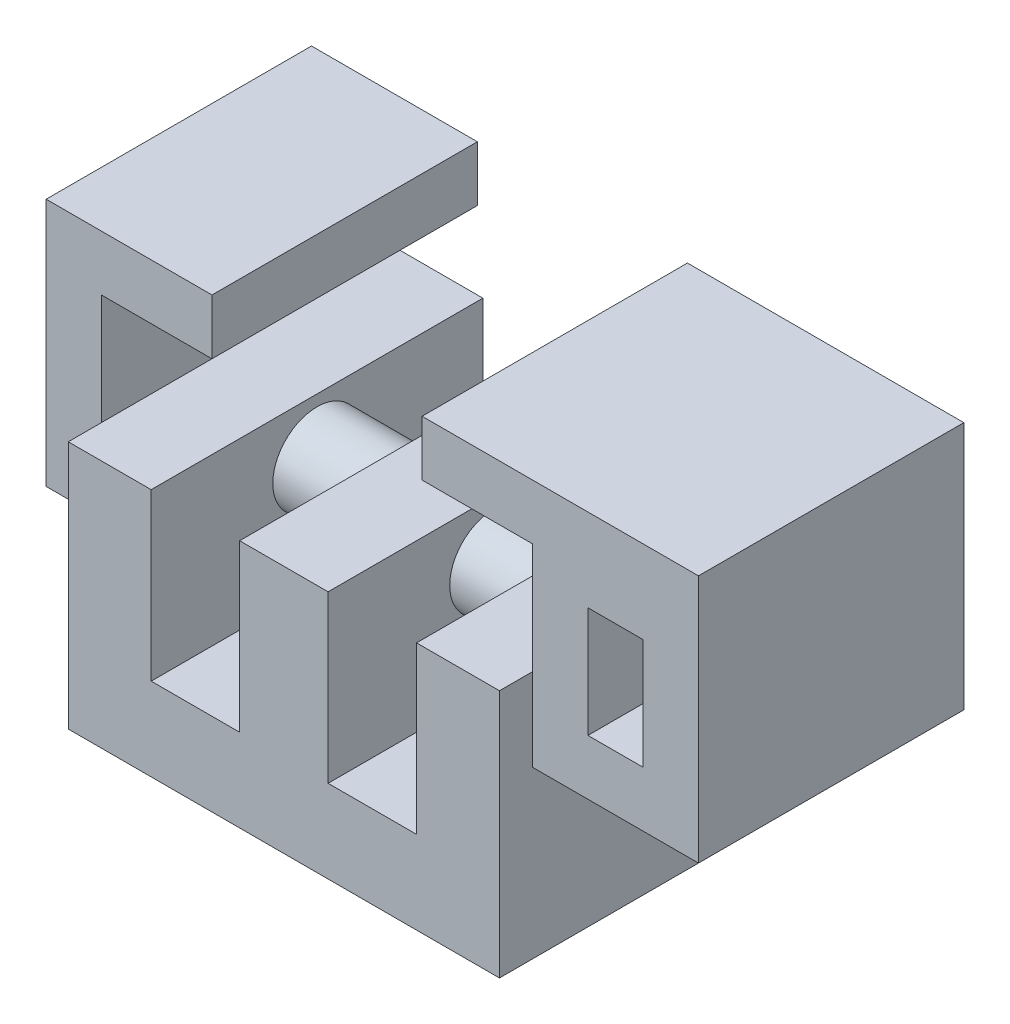
ISO-10303-21;
HEADER;
FILE_DESCRIPTION(('STEP AP214'),'2;1');
FILE_NAME('part.step','',(''),(''),'','','');
FILE_SCHEMA(('AUTOMOTIVE_DESIGN { 1 0 10303 214 1 1 1 1 }'));
ENDSEC;
DATA;
#1=APPLICATION_CONTEXT('core data for automotive mechanical design processes');
#2=APPLICATION_PROTOCOL_DEFINITION('international standard','automotive_design',2000,#1);
#3=PRODUCT_CONTEXT('',#1,'mechanical');
#4=PRODUCT('Part','Part','',(#3));
#5=PRODUCT_RELATED_PRODUCT_CATEGORY('part','',(#4));
#6=PRODUCT_DEFINITION_FORMATION('','',#4);
#7=PRODUCT_DEFINITION_CONTEXT('part definition',#1,'design');
#8=PRODUCT_DEFINITION('design','',#6,#7);
#9=PRODUCT_DEFINITION_SHAPE('','',#8);
#10=(LENGTH_UNIT() NAMED_UNIT(*) SI_UNIT(.MILLI.,.METRE.));
#11=(NAMED_UNIT(*) PLANE_ANGLE_UNIT() SI_UNIT($,.RADIAN.));
#12=(NAMED_UNIT(*) SI_UNIT($,.STERADIAN.) SOLID_ANGLE_UNIT());
#13=UNCERTAINTY_MEASURE_WITH_UNIT(LENGTH_MEASURE(1.E-05),#10,'distance_accuracy_value','');
#14=(GEOMETRIC_REPRESENTATION_CONTEXT(3) GLOBAL_UNCERTAINTY_ASSIGNED_CONTEXT((#13)) GLOBAL_UNIT_ASSIGNED_CONTEXT((#10,
#11,#12)) REPRESENTATION_CONTEXT('',''));
#15=CARTESIAN_POINT('',(0.,0.,0.));
#16=DIRECTION('',(0.,0.,1.));
#17=DIRECTION('',(1.,0.,0.));
#18=AXIS2_PLACEMENT_3D('',#15,#16,#17);
#19=CARTESIAN_POINT('',(0.,7.5,0.));
#20=DIRECTION('',(0.,-1.,0.));
#21=DIRECTION('',(0.,0.,-1.));
#22=AXIS2_PLACEMENT_3D('',#19,#20,#21);
#23=PLANE('',#22);
#24=DIRECTION('',(1.,0.,0.));
#25=VECTOR('',#24,1.);
#26=CARTESIAN_POINT('',(-19.5,7.5,15.));
#27=LINE('',#26,#25);
#28=CARTESIAN_POINT('',(-19.5,7.5,15.));
#29=VERTEX_POINT('',#28);
#30=CARTESIAN_POINT('',(-12.,7.5,15.));
#31=VERTEX_POINT('',#30);
#32=EDGE_CURVE('E490',#29,#31,#27,.T.);
#33=ORIENTED_EDGE('',*,*,#32,.T.);
#34=DIRECTION('',(0.,0.,1.));
#35=VECTOR('',#34,1.);
#36=CARTESIAN_POINT('',(-12.,7.5,-15.));
#37=LINE('',#36,#35);
#38=CARTESIAN_POINT('',(-12.,7.5,-15.));
#39=VERTEX_POINT('',#38);
#40=EDGE_CURVE('E314',#39,#31,#37,.T.);
#41=ORIENTED_EDGE('',*,*,#40,.F.);
#42=DIRECTION('',(-1.,0.,0.));
#43=VECTOR('',#42,1.);
#44=CARTESIAN_POINT('',(-19.5,7.5,-15.));
#45=LINE('',#44,#43);
#46=CARTESIAN_POINT('',(-19.5,7.5,-15.));
#47=VERTEX_POINT('',#46);
#48=EDGE_CURVE('E478',#39,#47,#45,.T.);
#49=ORIENTED_EDGE('',*,*,#48,.T.);
#50=DIRECTION('',(0.,0.,1.));
#51=VECTOR('',#50,1.);
#52=CARTESIAN_POINT('',(-19.5,7.5,15.));
#53=LINE('',#52,#51);
#54=CARTESIAN_POINT('',(-19.5,7.50000000000001,-12.));
#55=VERTEX_POINT('',#54);
#56=EDGE_CURVE('E485',#47,#55,#53,.T.);
#57=ORIENTED_EDGE('',*,*,#56,.T.);
#58=CARTESIAN_POINT('',(-19.5,7.50000000000001,12.));
#59=VERTEX_POINT('',#58);
#60=EDGE_CURVE('E489',#55,#59,#53,.T.);
#61=ORIENTED_EDGE('',*,*,#60,.T.);
#62=EDGE_CURVE('E483',#59,#29,#53,.T.);
#63=ORIENTED_EDGE('',*,*,#62,.T.);
#64=EDGE_LOOP('',(#33,#41,#49,#57,#61,#63));
#65=FACE_BOUND('',#64,.T.);
#66=ADVANCED_FACE('F36',(#65),#23,.F.);
#67=CARTESIAN_POINT('',(4.00000000000002,7.5,-15.));
#68=VERTEX_POINT('',#67);
#69=CARTESIAN_POINT('',(-3.99999999999998,7.5,-15.));
#70=VERTEX_POINT('',#69);
#71=EDGE_CURVE('E484',#68,#70,#45,.T.);
#72=ORIENTED_EDGE('',*,*,#71,.T.);
#73=DIRECTION('',(0.,0.,-1.));
#74=VECTOR('',#73,1.);
#75=CARTESIAN_POINT('',(-3.99999999999998,7.5,-15.));
#76=LINE('',#75,#74);
#77=CARTESIAN_POINT('',(-3.99999999999998,7.5,15.));
#78=VERTEX_POINT('',#77);
#79=EDGE_CURVE('E304',#78,#70,#76,.T.);
#80=ORIENTED_EDGE('',*,*,#79,.F.);
#81=CARTESIAN_POINT('',(4.00000000000002,7.5,15.));
#82=VERTEX_POINT('',#81);
#83=EDGE_CURVE('E494',#78,#82,#27,.T.);
#84=ORIENTED_EDGE('',*,*,#83,.T.);
#85=DIRECTION('',(0.,0.,1.));
#86=VECTOR('',#85,1.);
#87=CARTESIAN_POINT('',(4.00000000000002,7.5,-15.));
#88=LINE('',#87,#86);
#89=EDGE_CURVE('E316',#68,#82,#88,.T.);
#90=ORIENTED_EDGE('',*,*,#89,.F.);
#91=EDGE_LOOP('',(#72,#80,#84,#90));
#92=FACE_BOUND('',#91,.T.);
#93=ADVANCED_FACE('F602',(#92),#23,.F.);
#94=CARTESIAN_POINT('',(19.5,22.5,0.));
#95=DIRECTION('',(1.,0.,0.));
#96=DIRECTION('',(0.,0.,-1.));
#97=AXIS2_PLACEMENT_3D('',#94,#95,#96);
#98=PLANE('',#97);
#99=DIRECTION('',(0.,0.,1.));
#100=VECTOR('',#99,1.);
#101=CARTESIAN_POINT('',(19.5,17.5,-12.));
#102=LINE('',#101,#100);
#103=CARTESIAN_POINT('',(19.5,17.5,-12.));
#104=VERTEX_POINT('',#103);
#105=CARTESIAN_POINT('',(19.5,17.5,12.));
#106=VERTEX_POINT('',#105);
#107=EDGE_CURVE('E394',#104,#106,#102,.T.);
#108=ORIENTED_EDGE('',*,*,#107,.F.);
#109=DIRECTION('',(0.,-1.,0.));
#110=VECTOR('',#109,1.);
#111=CARTESIAN_POINT('',(19.5,22.5,-12.));
#112=LINE('',#111,#110);
#113=CARTESIAN_POINT('',(19.5,7.50000000000001,-12.));
#114=VERTEX_POINT('',#113);
#115=EDGE_CURVE('E431',#104,#114,#112,.T.);
#116=ORIENTED_EDGE('',*,*,#115,.T.);
#117=DIRECTION('',(0.,0.,-1.));
#118=VECTOR('',#117,1.);
#119=CARTESIAN_POINT('',(19.5,7.5,15.));
#120=LINE('',#119,#118);
#121=CARTESIAN_POINT('',(19.5,7.50000000000001,12.));
#122=VERTEX_POINT('',#121);
#123=EDGE_CURVE('E479',#122,#114,#120,.T.);
#124=ORIENTED_EDGE('',*,*,#123,.F.);
#125=DIRECTION('',(0.,-1.,0.));
#126=VECTOR('',#125,1.);
#127=CARTESIAN_POINT('',(19.5,22.5,12.));
#128=LINE('',#127,#126);
#129=EDGE_CURVE('E429',#106,#122,#128,.T.);
#130=ORIENTED_EDGE('',*,*,#129,.F.);
#131=EDGE_LOOP('',(#108,#116,#124,#130));
#132=FACE_BOUND('',#131,.T.);
#133=ADVANCED_FACE('F642',(#132),#98,.F.);
#134=CARTESIAN_POINT('',(-19.5,22.5,0.));
#135=DIRECTION('',(-1.,0.,0.));
#136=DIRECTION('',(0.,0.,1.));
#137=AXIS2_PLACEMENT_3D('',#134,#135,#136);
#138=PLANE('',#137);
#139=DIRECTION('',(0.,0.,-1.));
#140=VECTOR('',#139,1.);
#141=CARTESIAN_POINT('',(-19.5,17.5,-12.));
#142=LINE('',#141,#140);
#143=CARTESIAN_POINT('',(-19.5,17.5,12.));
#144=VERTEX_POINT('',#143);
#145=CARTESIAN_POINT('',(-19.5,17.5,-12.));
#146=VERTEX_POINT('',#145);
#147=EDGE_CURVE('E412',#144,#146,#142,.T.);
#148=ORIENTED_EDGE('',*,*,#147,.F.);
#149=DIRECTION('',(0.,-1.,0.));
#150=VECTOR('',#149,1.);
#151=CARTESIAN_POINT('',(-19.5,22.5,12.));
#152=LINE('',#151,#150);
#153=EDGE_CURVE('E455',#144,#59,#152,.T.);
#154=ORIENTED_EDGE('',*,*,#153,.T.);
#155=ORIENTED_EDGE('',*,*,#60,.F.);
#156=DIRECTION('',(0.,-1.,0.));
#157=VECTOR('',#156,1.);
#158=CARTESIAN_POINT('',(-19.5,22.5,-12.));
#159=LINE('',#158,#157);
#160=EDGE_CURVE('E471',#146,#55,#159,.T.);
#161=ORIENTED_EDGE('',*,*,#160,.F.);
#162=EDGE_LOOP('',(#148,#154,#155,#161));
#163=FACE_BOUND('',#162,.T.);
#164=ADVANCED_FACE('F568',(#163),#138,.F.);
#165=CARTESIAN_POINT('',(19.5,-15.,15.));
#166=DIRECTION('',(1.,0.,0.));
#167=DIRECTION('',(0.,0.,-1.));
#168=AXIS2_PLACEMENT_3D('',#165,#166,#167);
#169=PLANE('',#168);
#170=CARTESIAN_POINT('',(19.5,0.,12.));
#171=VERTEX_POINT('',#170);
#172=EDGE_CURVE('E432',#122,#171,#128,.T.);
#173=ORIENTED_EDGE('',*,*,#172,.F.);
#174=CARTESIAN_POINT('',(19.5,7.5,15.));
#175=VERTEX_POINT('',#174);
#176=EDGE_CURVE('E475',#175,#122,#120,.T.);
#177=ORIENTED_EDGE('',*,*,#176,.F.);
#178=DIRECTION('',(0.,1.,0.));
#179=VECTOR('',#178,1.);
#180=CARTESIAN_POINT('',(19.5,-15.,15.));
#181=LINE('',#180,#179);
#182=CARTESIAN_POINT('',(19.5,-15.,15.));
#183=VERTEX_POINT('',#182);
#184=EDGE_CURVE('E507',#183,#175,#181,.T.);
#185=ORIENTED_EDGE('',*,*,#184,.F.);
#186=DIRECTION('',(0.,0.,-1.));
#187=VECTOR('',#186,1.);
#188=CARTESIAN_POINT('',(19.5,-15.,15.));
#189=LINE('',#188,#187);
#190=CARTESIAN_POINT('',(19.5,-15.,-15.));
#191=VERTEX_POINT('',#190);
#192=EDGE_CURVE('E493',#183,#191,#189,.T.);
#193=ORIENTED_EDGE('',*,*,#192,.T.);
#194=DIRECTION('',(0.,1.,0.));
#195=VECTOR('',#194,1.);
#196=CARTESIAN_POINT('',(19.5,-15.,-15.));
#197=LINE('',#196,#195);
#198=CARTESIAN_POINT('',(19.5,7.5,-15.));
#199=VERTEX_POINT('',#198);
#200=EDGE_CURVE('E506',#191,#199,#197,.T.);
#201=ORIENTED_EDGE('',*,*,#200,.T.);
#202=EDGE_CURVE('E473',#114,#199,#120,.T.);
#203=ORIENTED_EDGE('',*,*,#202,.F.);
#204=CARTESIAN_POINT('',(19.5,0.,-12.));
#205=VERTEX_POINT('',#204);
#206=EDGE_CURVE('E435',#114,#205,#112,.T.);
#207=ORIENTED_EDGE('',*,*,#206,.T.);
#208=DIRECTION('',(0.,0.,1.));
#209=VECTOR('',#208,1.);
#210=CARTESIAN_POINT('',(19.5,0.,0.));
#211=LINE('',#210,#209);
#212=EDGE_CURVE('E436',#205,#171,#211,.T.);
#213=ORIENTED_EDGE('',*,*,#212,.T.);
#214=EDGE_LOOP('',(#173,#177,#185,#193,#201,#203,#207,#213));
#215=FACE_BOUND('',#214,.T.);
#216=ADVANCED_FACE('F38',(#215),#169,.T.);
#217=CARTESIAN_POINT('',(-19.5,-15.,15.));
#218=DIRECTION('',(0.,0.,1.));
#219=DIRECTION('',(1.,0.,0.));
#220=AXIS2_PLACEMENT_3D('',#217,#218,#219);
#221=PLANE('',#220);
#222=DIRECTION('',(0.,1.,0.));
#223=VECTOR('',#222,1.);
#224=CARTESIAN_POINT('',(-12.,-7.5,15.));
#225=LINE('',#224,#223);
#226=CARTESIAN_POINT('',(-12.,-7.5,15.));
#227=VERTEX_POINT('',#226);
#228=EDGE_CURVE('E313',#227,#31,#225,.T.);
#229=ORIENTED_EDGE('',*,*,#228,.T.);
#230=ORIENTED_EDGE('',*,*,#32,.F.);
#231=DIRECTION('',(0.,1.,0.));
#232=VECTOR('',#231,1.);
#233=CARTESIAN_POINT('',(-19.5,-15.,15.));
#234=LINE('',#233,#232);
#235=CARTESIAN_POINT('',(-19.5,-15.,15.));
#236=VERTEX_POINT('',#235);
#237=EDGE_CURVE('E510',#236,#29,#234,.T.);
#238=ORIENTED_EDGE('',*,*,#237,.F.);
#239=DIRECTION('',(1.,0.,0.));
#240=VECTOR('',#239,1.);
#241=CARTESIAN_POINT('',(-19.5,-15.,15.));
#242=LINE('',#241,#240);
#243=EDGE_CURVE('E503',#236,#183,#242,.T.);
#244=ORIENTED_EDGE('',*,*,#243,.T.);
#245=ORIENTED_EDGE('',*,*,#184,.T.);
#246=CARTESIAN_POINT('',(12.,7.5,15.));
#247=VERTEX_POINT('',#246);
#248=EDGE_CURVE('E488',#247,#175,#27,.T.);
#249=ORIENTED_EDGE('',*,*,#248,.F.);
#250=DIRECTION('',(0.,1.,0.));
#251=VECTOR('',#250,1.);
#252=CARTESIAN_POINT('',(12.,-7.5,15.));
#253=LINE('',#252,#251);
#254=CARTESIAN_POINT('',(12.,-7.5,15.));
#255=VERTEX_POINT('',#254);
#256=EDGE_CURVE('E61',#255,#247,#253,.T.);
#257=ORIENTED_EDGE('',*,*,#256,.F.);
#258=DIRECTION('',(1.,0.,0.));
#259=VECTOR('',#258,1.);
#260=CARTESIAN_POINT('',(4.00000000000002,-7.5,15.));
#261=LINE('',#260,#259);
#262=CARTESIAN_POINT('',(4.00000000000002,-7.5,15.));
#263=VERTEX_POINT('',#262);
#264=EDGE_CURVE('E346',#263,#255,#261,.T.);
#265=ORIENTED_EDGE('',*,*,#264,.F.);
#266=DIRECTION('',(0.,1.,0.));
#267=VECTOR('',#266,1.);
#268=CARTESIAN_POINT('',(4.00000000000002,-7.5,15.));
#269=LINE('',#268,#267);
#270=EDGE_CURVE('E328',#263,#82,#269,.T.);
#271=ORIENTED_EDGE('',*,*,#270,.T.);
#272=ORIENTED_EDGE('',*,*,#83,.F.);
#273=DIRECTION('',(0.,1.,0.));
#274=VECTOR('',#273,1.);
#275=CARTESIAN_POINT('',(-3.99999999999998,-7.5,15.));
#276=LINE('',#275,#274);
#277=CARTESIAN_POINT('',(-3.99999999999998,-7.5,15.));
#278=VERTEX_POINT('',#277);
#279=EDGE_CURVE('E324',#278,#78,#276,.T.);
#280=ORIENTED_EDGE('',*,*,#279,.F.);
#281=DIRECTION('',(1.,0.,0.));
#282=VECTOR('',#281,1.);
#283=CARTESIAN_POINT('',(-12.,-7.5,15.));
#284=LINE('',#283,#282);
#285=EDGE_CURVE('E303',#227,#278,#284,.T.);
#286=ORIENTED_EDGE('',*,*,#285,.F.);
#287=EDGE_LOOP('',(#229,#230,#238,#244,#245,#249,#257,#265,#271,#272,#280,#286));
#288=FACE_BOUND('',#287,.T.);
#289=ADVANCED_FACE('F584',(#288),#221,.T.);
#290=CARTESIAN_POINT('',(-19.5,-15.,15.));
#291=DIRECTION('',(-1.,0.,0.));
#292=DIRECTION('',(0.,0.,1.));
#293=AXIS2_PLACEMENT_3D('',#290,#291,#292);
#294=PLANE('',#293);
#295=CARTESIAN_POINT('',(-19.5,0.,-12.));
#296=VERTEX_POINT('',#295);
#297=EDGE_CURVE('E474',#55,#296,#159,.T.);
#298=ORIENTED_EDGE('',*,*,#297,.F.);
#299=ORIENTED_EDGE('',*,*,#56,.F.);
#300=DIRECTION('',(0.,1.,0.));
#301=VECTOR('',#300,1.);
#302=CARTESIAN_POINT('',(-19.5,-15.,-15.));
#303=LINE('',#302,#301);
#304=CARTESIAN_POINT('',(-19.5,-15.,-15.));
#305=VERTEX_POINT('',#304);
#306=EDGE_CURVE('E513',#305,#47,#303,.T.);
#307=ORIENTED_EDGE('',*,*,#306,.F.);
#308=DIRECTION('',(0.,0.,1.));
#309=VECTOR('',#308,1.);
#310=CARTESIAN_POINT('',(-19.5,-15.,15.));
#311=LINE('',#310,#309);
#312=EDGE_CURVE('E500',#305,#236,#311,.T.);
#313=ORIENTED_EDGE('',*,*,#312,.T.);
#314=ORIENTED_EDGE('',*,*,#237,.T.);
#315=ORIENTED_EDGE('',*,*,#62,.F.);
#316=CARTESIAN_POINT('',(-19.5,0.,12.));
#317=VERTEX_POINT('',#316);
#318=EDGE_CURVE('E465',#59,#317,#152,.T.);
#319=ORIENTED_EDGE('',*,*,#318,.T.);
#320=DIRECTION('',(0.,0.,-1.));
#321=VECTOR('',#320,1.);
#322=CARTESIAN_POINT('',(-19.5,0.,0.));
#323=LINE('',#322,#321);
#324=EDGE_CURVE('E445',#317,#296,#323,.T.);
#325=ORIENTED_EDGE('',*,*,#324,.T.);
#326=EDGE_LOOP('',(#298,#299,#307,#313,#314,#315,#319,#325));
#327=FACE_BOUND('',#326,.T.);
#328=ADVANCED_FACE('F536',(#327),#294,.T.);
#329=CARTESIAN_POINT('',(-19.5,-15.,-15.));
#330=DIRECTION('',(0.,0.,-1.));
#331=DIRECTION('',(-1.,0.,0.));
#332=AXIS2_PLACEMENT_3D('',#329,#330,#331);
#333=PLANE('',#332);
#334=DIRECTION('',(0.,1.,0.));
#335=VECTOR('',#334,1.);
#336=CARTESIAN_POINT('',(-12.,-7.5,-15.));
#337=LINE('',#336,#335);
#338=CARTESIAN_POINT('',(-12.,-7.5,-15.));
#339=VERTEX_POINT('',#338);
#340=EDGE_CURVE('E318',#339,#39,#337,.T.);
#341=ORIENTED_EDGE('',*,*,#340,.F.);
#342=DIRECTION('',(-1.,0.,0.));
#343=VECTOR('',#342,1.);
#344=CARTESIAN_POINT('',(-12.,-7.5,-15.));
#345=LINE('',#344,#343);
#346=CARTESIAN_POINT('',(-3.99999999999998,-7.5,-15.));
#347=VERTEX_POINT('',#346);
#348=EDGE_CURVE('E310',#347,#339,#345,.T.);
#349=ORIENTED_EDGE('',*,*,#348,.F.);
#350=DIRECTION('',(0.,1.,0.));
#351=VECTOR('',#350,1.);
#352=CARTESIAN_POINT('',(-3.99999999999998,-7.5,-15.));
#353=LINE('',#352,#351);
#354=EDGE_CURVE('E321',#347,#70,#353,.T.);
#355=ORIENTED_EDGE('',*,*,#354,.T.);
#356=ORIENTED_EDGE('',*,*,#71,.F.);
#357=DIRECTION('',(0.,1.,0.));
#358=VECTOR('',#357,1.);
#359=CARTESIAN_POINT('',(4.00000000000002,-7.5,-15.));
#360=LINE('',#359,#358);
#361=CARTESIAN_POINT('',(4.00000000000002,-7.5,-15.));
#362=VERTEX_POINT('',#361);
#363=EDGE_CURVE('E294',#362,#68,#360,.T.);
#364=ORIENTED_EDGE('',*,*,#363,.F.);
#365=DIRECTION('',(-1.,0.,0.));
#366=VECTOR('',#365,1.);
#367=CARTESIAN_POINT('',(4.00000000000002,-7.5,-15.));
#368=LINE('',#367,#366);
#369=CARTESIAN_POINT('',(12.,-7.5,-15.));
#370=VERTEX_POINT('',#369);
#371=EDGE_CURVE('E331',#370,#362,#368,.T.);
#372=ORIENTED_EDGE('',*,*,#371,.F.);
#373=DIRECTION('',(0.,1.,0.));
#374=VECTOR('',#373,1.);
#375=CARTESIAN_POINT('',(12.,-7.5,-15.));
#376=LINE('',#375,#374);
#377=CARTESIAN_POINT('',(12.,7.5,-15.));
#378=VERTEX_POINT('',#377);
#379=EDGE_CURVE('E333',#370,#378,#376,.T.);
#380=ORIENTED_EDGE('',*,*,#379,.T.);
#381=EDGE_CURVE('E480',#199,#378,#45,.T.);
#382=ORIENTED_EDGE('',*,*,#381,.F.);
#383=ORIENTED_EDGE('',*,*,#200,.F.);
#384=DIRECTION('',(-1.,0.,0.));
#385=VECTOR('',#384,1.);
#386=CARTESIAN_POINT('',(-19.5,-15.,-15.));
#387=LINE('',#386,#385);
#388=EDGE_CURVE('E497',#191,#305,#387,.T.);
#389=ORIENTED_EDGE('',*,*,#388,.T.);
#390=ORIENTED_EDGE('',*,*,#306,.T.);
#391=ORIENTED_EDGE('',*,*,#48,.F.);
#392=EDGE_LOOP('',(#341,#349,#355,#356,#364,#372,#380,#382,#383,#389,#390,#391));
#393=FACE_BOUND('',#392,.T.);
#394=ADVANCED_FACE('F576',(#393),#333,.T.);
#395=CARTESIAN_POINT('',(0.,-15.,0.));
#396=DIRECTION('',(0.,-1.,0.));
#397=DIRECTION('',(0.,0.,-1.));
#398=AXIS2_PLACEMENT_3D('',#395,#396,#397);
#399=PLANE('',#398);
#400=DIRECTION('',(0.,0.,1.));
#401=VECTOR('',#400,1.);
#402=CARTESIAN_POINT('',(10.,-15.,-5.));
#403=LINE('',#402,#401);
#404=CARTESIAN_POINT('',(10.,-15.,-5.));
#405=VERTEX_POINT('',#404);
#406=CARTESIAN_POINT('',(10.,-15.,5.));
#407=VERTEX_POINT('',#406);
#408=EDGE_CURVE('E53',#405,#407,#403,.T.);
#409=ORIENTED_EDGE('',*,*,#408,.F.);
#410=DIRECTION('',(1.,0.,0.));
#411=VECTOR('',#410,1.);
#412=CARTESIAN_POINT('',(-10.,-15.,-5.));
#413=LINE('',#412,#411);
#414=CARTESIAN_POINT('',(-10.,-15.,-5.));
#415=VERTEX_POINT('',#414);
#416=EDGE_CURVE('E279',#415,#405,#413,.T.);
#417=ORIENTED_EDGE('',*,*,#416,.F.);
#418=DIRECTION('',(0.,0.,-1.));
#419=VECTOR('',#418,1.);
#420=CARTESIAN_POINT('',(-10.,-15.,-5.));
#421=LINE('',#420,#419);
#422=CARTESIAN_POINT('',(-10.,-15.,5.));
#423=VERTEX_POINT('',#422);
#424=EDGE_CURVE('E282',#423,#415,#421,.T.);
#425=ORIENTED_EDGE('',*,*,#424,.F.);
#426=DIRECTION('',(-1.,0.,0.));
#427=VECTOR('',#426,1.);
#428=CARTESIAN_POINT('',(-10.,-15.,5.));
#429=LINE('',#428,#427);
#430=EDGE_CURVE('E288',#407,#423,#429,.T.);
#431=ORIENTED_EDGE('',*,*,#430,.F.);
#432=EDGE_LOOP('',(#409,#417,#425,#431));
#433=FACE_BOUND('',#432,.T.);
#434=ORIENTED_EDGE('',*,*,#192,.F.);
#435=ORIENTED_EDGE('',*,*,#243,.F.);
#436=ORIENTED_EDGE('',*,*,#312,.F.);
#437=ORIENTED_EDGE('',*,*,#388,.F.);
#438=EDGE_LOOP('',(#434,#435,#436,#437));
#439=FACE_BOUND('',#438,.T.);
#440=ADVANCED_FACE('F582',(#433,#439),#399,.T.);
#441=ORIENTED_EDGE('',*,*,#381,.T.);
#442=DIRECTION('',(0.,0.,-1.));
#443=VECTOR('',#442,1.);
#444=CARTESIAN_POINT('',(12.,7.5,-15.));
#445=LINE('',#444,#443);
#446=EDGE_CURVE('E337',#247,#378,#445,.T.);
#447=ORIENTED_EDGE('',*,*,#446,.F.);
#448=ORIENTED_EDGE('',*,*,#248,.T.);
#449=ORIENTED_EDGE('',*,*,#176,.T.);
#450=ORIENTED_EDGE('',*,*,#123,.T.);
#451=ORIENTED_EDGE('',*,*,#202,.T.);
#452=EDGE_LOOP('',(#441,#447,#448,#449,#450,#451));
#453=FACE_BOUND('',#452,.T.);
#454=ADVANCED_FACE('F613',(#453),#23,.F.);
#455=CARTESIAN_POINT('',(-19.5,22.5,-12.));
#456=DIRECTION('',(0.,0.,1.));
#457=DIRECTION('',(1.,0.,0.));
#458=AXIS2_PLACEMENT_3D('',#455,#456,#457);
#459=PLANE('',#458);
#460=DIRECTION('',(-1.,0.,0.));
#461=VECTOR('',#460,1.);
#462=CARTESIAN_POINT('',(-19.5,0.,-12.));
#463=LINE('',#462,#461);
#464=CARTESIAN_POINT('',(-24.5,0.,-12.));
#465=VERTEX_POINT('',#464);
#466=EDGE_CURVE('E458',#296,#465,#463,.T.);
#467=ORIENTED_EDGE('',*,*,#466,.T.);
#468=DIRECTION('',(0.,-1.,0.));
#469=VECTOR('',#468,1.);
#470=CARTESIAN_POINT('',(-24.5,22.5,-12.));
#471=LINE('',#470,#469);
#472=CARTESIAN_POINT('',(-24.5,22.5,-12.));
#473=VERTEX_POINT('',#472);
#474=EDGE_CURVE('E468',#473,#465,#471,.T.);
#475=ORIENTED_EDGE('',*,*,#474,.F.);
#476=DIRECTION('',(-1.,0.,0.));
#477=VECTOR('',#476,1.);
#478=CARTESIAN_POINT('',(-19.5,22.5,-12.));
#479=LINE('',#478,#477);
#480=CARTESIAN_POINT('',(-9.49999999999999,22.5,-12.));
#481=VERTEX_POINT('',#480);
#482=EDGE_CURVE('E448',#481,#473,#479,.T.);
#483=ORIENTED_EDGE('',*,*,#482,.F.);
#484=DIRECTION('',(0.,1.,0.));
#485=VECTOR('',#484,1.);
#486=CARTESIAN_POINT('',(-9.49999999999999,22.5,-12.));
#487=LINE('',#486,#485);
#488=CARTESIAN_POINT('',(-9.49999999999999,17.5,-12.));
#489=VERTEX_POINT('',#488);
#490=EDGE_CURVE('E413',#489,#481,#487,.T.);
#491=ORIENTED_EDGE('',*,*,#490,.F.);
#492=DIRECTION('',(-1.,0.,0.));
#493=VECTOR('',#492,1.);
#494=CARTESIAN_POINT('',(-9.49999999999999,17.5,-12.));
#495=LINE('',#494,#493);
#496=EDGE_CURVE('E423',#489,#146,#495,.T.);
#497=ORIENTED_EDGE('',*,*,#496,.T.);
#498=ORIENTED_EDGE('',*,*,#160,.T.);
#499=ORIENTED_EDGE('',*,*,#297,.T.);
#500=EDGE_LOOP('',(#467,#475,#483,#491,#497,#498,#499));
#501=FACE_BOUND('',#500,.T.);
#502=ADVANCED_FACE('F550',(#501),#459,.F.);
#503=CARTESIAN_POINT('',(-24.5,22.5,-12.));
#504=DIRECTION('',(1.,0.,0.));
#505=DIRECTION('',(0.,0.,-1.));
#506=AXIS2_PLACEMENT_3D('',#503,#504,#505);
#507=PLANE('',#506);
#508=DIRECTION('',(0.,0.,1.));
#509=VECTOR('',#508,1.);
#510=CARTESIAN_POINT('',(-24.5,0.,-12.));
#511=LINE('',#510,#509);
#512=CARTESIAN_POINT('',(-24.5,0.,12.));
#513=VERTEX_POINT('',#512);
#514=EDGE_CURVE('E460',#465,#513,#511,.T.);
#515=ORIENTED_EDGE('',*,*,#514,.T.);
#516=DIRECTION('',(0.,-1.,0.));
#517=VECTOR('',#516,1.);
#518=CARTESIAN_POINT('',(-24.5,22.5,12.));
#519=LINE('',#518,#517);
#520=CARTESIAN_POINT('',(-24.5,22.5,12.));
#521=VERTEX_POINT('',#520);
#522=EDGE_CURVE('E464',#521,#513,#519,.T.);
#523=ORIENTED_EDGE('',*,*,#522,.F.);
#524=DIRECTION('',(0.,0.,1.));
#525=VECTOR('',#524,1.);
#526=CARTESIAN_POINT('',(-24.5,22.5,-12.));
#527=LINE('',#526,#525);
#528=EDGE_CURVE('E450',#473,#521,#527,.T.);
#529=ORIENTED_EDGE('',*,*,#528,.F.);
#530=ORIENTED_EDGE('',*,*,#474,.T.);
#531=EDGE_LOOP('',(#515,#523,#529,#530));
#532=FACE_BOUND('',#531,.T.);
#533=ADVANCED_FACE('F553',(#532),#507,.F.);
#534=CARTESIAN_POINT('',(-24.5,22.5,12.));
#535=DIRECTION('',(0.,0.,-1.));
#536=DIRECTION('',(-1.,0.,0.));
#537=AXIS2_PLACEMENT_3D('',#534,#535,#536);
#538=PLANE('',#537);
#539=DIRECTION('',(1.,0.,0.));
#540=VECTOR('',#539,1.);
#541=CARTESIAN_POINT('',(-24.5,0.,12.));
#542=LINE('',#541,#540);
#543=EDGE_CURVE('E451',#513,#317,#542,.T.);
#544=ORIENTED_EDGE('',*,*,#543,.T.);
#545=ORIENTED_EDGE('',*,*,#318,.F.);
#546=ORIENTED_EDGE('',*,*,#153,.F.);
#547=DIRECTION('',(-1.,0.,0.));
#548=VECTOR('',#547,1.);
#549=CARTESIAN_POINT('',(-9.49999999999999,17.5,12.));
#550=LINE('',#549,#548);
#551=CARTESIAN_POINT('',(-9.49999999999999,17.5,12.));
#552=VERTEX_POINT('',#551);
#553=EDGE_CURVE('E427',#552,#144,#550,.T.);
#554=ORIENTED_EDGE('',*,*,#553,.F.);
#555=DIRECTION('',(0.,-1.,0.));
#556=VECTOR('',#555,1.);
#557=CARTESIAN_POINT('',(-9.49999999999999,22.5,12.));
#558=LINE('',#557,#556);
#559=CARTESIAN_POINT('',(-9.49999999999999,22.5,12.));
#560=VERTEX_POINT('',#559);
#561=EDGE_CURVE('E419',#560,#552,#558,.T.);
#562=ORIENTED_EDGE('',*,*,#561,.F.);
#563=DIRECTION('',(1.,0.,0.));
#564=VECTOR('',#563,1.);
#565=CARTESIAN_POINT('',(-24.5,22.5,12.));
#566=LINE('',#565,#564);
#567=EDGE_CURVE('E453',#521,#560,#566,.T.);
#568=ORIENTED_EDGE('',*,*,#567,.F.);
#569=ORIENTED_EDGE('',*,*,#522,.T.);
#570=EDGE_LOOP('',(#544,#545,#546,#554,#562,#568,#569));
#571=FACE_BOUND('',#570,.T.);
#572=ADVANCED_FACE('F541',(#571),#538,.F.);
#573=CARTESIAN_POINT('',(0.,22.5,0.));
#574=DIRECTION('',(0.,1.,0.));
#575=DIRECTION('',(0.,0.,1.));
#576=AXIS2_PLACEMENT_3D('',#573,#574,#575);
#577=PLANE('',#576);
#578=ORIENTED_EDGE('',*,*,#567,.T.);
#579=DIRECTION('',(0.,0.,1.));
#580=VECTOR('',#579,1.);
#581=CARTESIAN_POINT('',(-9.49999999999999,22.5,-12.));
#582=LINE('',#581,#580);
#583=EDGE_CURVE('E416',#481,#560,#582,.T.);
#584=ORIENTED_EDGE('',*,*,#583,.F.);
#585=ORIENTED_EDGE('',*,*,#482,.T.);
#586=ORIENTED_EDGE('',*,*,#528,.T.);
#587=EDGE_LOOP('',(#578,#584,#585,#586));
#588=FACE_BOUND('',#587,.T.);
#589=ADVANCED_FACE('F555',(#588),#577,.T.);
#590=CARTESIAN_POINT('',(0.,0.,0.));
#591=DIRECTION('',(0.,1.,0.));
#592=DIRECTION('',(0.,0.,1.));
#593=AXIS2_PLACEMENT_3D('',#590,#591,#592);
#594=PLANE('',#593);
#595=ORIENTED_EDGE('',*,*,#324,.F.);
#596=ORIENTED_EDGE('',*,*,#543,.F.);
#597=ORIENTED_EDGE('',*,*,#514,.F.);
#598=ORIENTED_EDGE('',*,*,#466,.F.);
#599=EDGE_LOOP('',(#595,#596,#597,#598));
#600=FACE_BOUND('',#599,.T.);
#601=ADVANCED_FACE('F548',(#600),#594,.F.);
#602=CARTESIAN_POINT('',(24.5,22.5,12.));
#603=DIRECTION('',(0.,0.,-1.));
#604=DIRECTION('',(-1.,0.,0.));
#605=AXIS2_PLACEMENT_3D('',#602,#603,#604);
#606=PLANE('',#605);
#607=DIRECTION('',(-1.,0.,0.));
#608=VECTOR('',#607,1.);
#609=CARTESIAN_POINT('',(24.5,5.,12.));
#610=LINE('',#609,#608);
#611=CARTESIAN_POINT('',(29.5,5.,12.));
#612=VERTEX_POINT('',#611);
#613=CARTESIAN_POINT('',(24.5,5.,12.));
#614=VERTEX_POINT('',#613);
#615=EDGE_CURVE('E376',#612,#614,#610,.T.);
#616=ORIENTED_EDGE('',*,*,#615,.T.);
#617=DIRECTION('',(0.,1.,0.));
#618=VECTOR('',#617,1.);
#619=CARTESIAN_POINT('',(24.5,22.5,12.));
#620=LINE('',#619,#618);
#621=CARTESIAN_POINT('',(24.5,15.,12.));
#622=VERTEX_POINT('',#621);
#623=EDGE_CURVE('E379',#614,#622,#620,.T.);
#624=ORIENTED_EDGE('',*,*,#623,.T.);
#625=DIRECTION('',(1.,0.,0.));
#626=VECTOR('',#625,1.);
#627=CARTESIAN_POINT('',(24.5,15.,12.));
#628=LINE('',#627,#626);
#629=CARTESIAN_POINT('',(29.5,15.,12.));
#630=VERTEX_POINT('',#629);
#631=EDGE_CURVE('E364',#622,#630,#628,.T.);
#632=ORIENTED_EDGE('',*,*,#631,.T.);
#633=DIRECTION('',(0.,-1.,0.));
#634=VECTOR('',#633,1.);
#635=CARTESIAN_POINT('',(29.5,22.5,12.));
#636=LINE('',#635,#634);
#637=EDGE_CURVE('E373',#630,#612,#636,.T.);
#638=ORIENTED_EDGE('',*,*,#637,.T.);
#639=EDGE_LOOP('',(#616,#624,#632,#638));
#640=FACE_BOUND('',#639,.T.);
#641=DIRECTION('',(1.,0.,0.));
#642=VECTOR('',#641,1.);
#643=CARTESIAN_POINT('',(24.5,0.,12.));
#644=LINE('',#643,#642);
#645=CARTESIAN_POINT('',(34.5,0.,12.));
#646=VERTEX_POINT('',#645);
#647=EDGE_CURVE('E443',#171,#646,#644,.T.);
#648=ORIENTED_EDGE('',*,*,#647,.T.);
#649=DIRECTION('',(0.,-1.,0.));
#650=VECTOR('',#649,1.);
#651=CARTESIAN_POINT('',(34.5,22.5,12.));
#652=LINE('',#651,#650);
#653=CARTESIAN_POINT('',(34.5,22.5,12.));
#654=VERTEX_POINT('',#653);
#655=EDGE_CURVE('E382',#654,#646,#652,.T.);
#656=ORIENTED_EDGE('',*,*,#655,.F.);
#657=DIRECTION('',(1.,0.,0.));
#658=VECTOR('',#657,1.);
#659=CARTESIAN_POINT('',(24.5,22.5,12.));
#660=LINE('',#659,#658);
#661=CARTESIAN_POINT('',(9.50000000000002,22.5,12.));
#662=VERTEX_POINT('',#661);
#663=EDGE_CURVE('E440',#662,#654,#660,.T.);
#664=ORIENTED_EDGE('',*,*,#663,.F.);
#665=DIRECTION('',(0.,1.,0.));
#666=VECTOR('',#665,1.);
#667=CARTESIAN_POINT('',(9.50000000000002,22.5,12.));
#668=LINE('',#667,#666);
#669=CARTESIAN_POINT('',(9.50000000000002,17.5,12.));
#670=VERTEX_POINT('',#669);
#671=EDGE_CURVE('E400',#670,#662,#668,.T.);
#672=ORIENTED_EDGE('',*,*,#671,.F.);
#673=DIRECTION('',(1.,0.,0.));
#674=VECTOR('',#673,1.);
#675=CARTESIAN_POINT('',(9.50000000000002,17.5,12.));
#676=LINE('',#675,#674);
#677=EDGE_CURVE('E406',#670,#106,#676,.T.);
#678=ORIENTED_EDGE('',*,*,#677,.T.);
#679=ORIENTED_EDGE('',*,*,#129,.T.);
#680=ORIENTED_EDGE('',*,*,#172,.T.);
#681=EDGE_LOOP('',(#648,#656,#664,#672,#678,#679,#680));
#682=FACE_BOUND('',#681,.T.);
#683=ADVANCED_FACE('F632',(#640,#682),#606,.F.);
#684=CARTESIAN_POINT('',(19.5,22.5,-12.));
#685=DIRECTION('',(0.,0.,1.));
#686=DIRECTION('',(1.,0.,0.));
#687=AXIS2_PLACEMENT_3D('',#684,#685,#686);
#688=PLANE('',#687);
#689=DIRECTION('',(1.,0.,0.));
#690=VECTOR('',#689,1.);
#691=CARTESIAN_POINT('',(29.5,15.,-12.));
#692=LINE('',#691,#690);
#693=CARTESIAN_POINT('',(24.5,15.,-12.));
#694=VERTEX_POINT('',#693);
#695=CARTESIAN_POINT('',(29.5,15.,-12.));
#696=VERTEX_POINT('',#695);
#697=EDGE_CURVE('E352',#694,#696,#692,.T.);
#698=ORIENTED_EDGE('',*,*,#697,.F.);
#699=DIRECTION('',(0.,1.,0.));
#700=VECTOR('',#699,1.);
#701=CARTESIAN_POINT('',(24.5,15.,-12.));
#702=LINE('',#701,#700);
#703=CARTESIAN_POINT('',(24.5,5.,-12.));
#704=VERTEX_POINT('',#703);
#705=EDGE_CURVE('E320',#704,#694,#702,.T.);
#706=ORIENTED_EDGE('',*,*,#705,.F.);
#707=DIRECTION('',(-1.,0.,0.));
#708=VECTOR('',#707,1.);
#709=CARTESIAN_POINT('',(29.5,5.,-12.));
#710=LINE('',#709,#708);
#711=CARTESIAN_POINT('',(29.5,5.,-12.));
#712=VERTEX_POINT('',#711);
#713=EDGE_CURVE('E358',#712,#704,#710,.T.);
#714=ORIENTED_EDGE('',*,*,#713,.F.);
#715=DIRECTION('',(0.,-1.,0.));
#716=VECTOR('',#715,1.);
#717=CARTESIAN_POINT('',(29.5,15.,-12.));
#718=LINE('',#717,#716);
#719=EDGE_CURVE('E355',#696,#712,#718,.T.);
#720=ORIENTED_EDGE('',*,*,#719,.F.);
#721=EDGE_LOOP('',(#698,#706,#714,#720));
#722=FACE_BOUND('',#721,.T.);
#723=DIRECTION('',(-1.,0.,0.));
#724=VECTOR('',#723,1.);
#725=CARTESIAN_POINT('',(19.5,0.,-12.));
#726=LINE('',#725,#724);
#727=CARTESIAN_POINT('',(34.5,0.,-12.));
#728=VERTEX_POINT('',#727);
#729=EDGE_CURVE('E439',#728,#205,#726,.T.);
#730=ORIENTED_EDGE('',*,*,#729,.T.);
#731=ORIENTED_EDGE('',*,*,#206,.F.);
#732=ORIENTED_EDGE('',*,*,#115,.F.);
#733=DIRECTION('',(1.,0.,0.));
#734=VECTOR('',#733,1.);
#735=CARTESIAN_POINT('',(9.50000000000002,17.5,-12.));
#736=LINE('',#735,#734);
#737=CARTESIAN_POINT('',(9.50000000000002,17.5,-12.));
#738=VERTEX_POINT('',#737);
#739=EDGE_CURVE('E410',#738,#104,#736,.T.);
#740=ORIENTED_EDGE('',*,*,#739,.F.);
#741=DIRECTION('',(0.,-1.,0.));
#742=VECTOR('',#741,1.);
#743=CARTESIAN_POINT('',(9.50000000000002,22.5,-12.));
#744=LINE('',#743,#742);
#745=CARTESIAN_POINT('',(9.50000000000002,22.5,-12.));
#746=VERTEX_POINT('',#745);
#747=EDGE_CURVE('E395',#746,#738,#744,.T.);
#748=ORIENTED_EDGE('',*,*,#747,.F.);
#749=DIRECTION('',(-1.,0.,0.));
#750=VECTOR('',#749,1.);
#751=CARTESIAN_POINT('',(19.5,22.5,-12.));
#752=LINE('',#751,#750);
#753=CARTESIAN_POINT('',(34.5,22.5,-12.));
#754=VERTEX_POINT('',#753);
#755=EDGE_CURVE('E434',#754,#746,#752,.T.);
#756=ORIENTED_EDGE('',*,*,#755,.F.);
#757=DIRECTION('',(0.,1.,0.));
#758=VECTOR('',#757,1.);
#759=CARTESIAN_POINT('',(34.5,22.5,-12.));
#760=LINE('',#759,#758);
#761=EDGE_CURVE('E388',#728,#754,#760,.T.);
#762=ORIENTED_EDGE('',*,*,#761,.F.);
#763=EDGE_LOOP('',(#730,#731,#732,#740,#748,#756,#762));
#764=FACE_BOUND('',#763,.T.);
#765=ADVANCED_FACE('F621',(#722,#764),#688,.F.);
#766=CARTESIAN_POINT('',(0.,22.5,0.));
#767=DIRECTION('',(0.,-1.,0.));
#768=DIRECTION('',(0.,0.,-1.));
#769=AXIS2_PLACEMENT_3D('',#766,#767,#768);
#770=PLANE('',#769);
#771=ORIENTED_EDGE('',*,*,#755,.T.);
#772=DIRECTION('',(0.,0.,-1.));
#773=VECTOR('',#772,1.);
#774=CARTESIAN_POINT('',(9.50000000000002,22.5,-12.));
#775=LINE('',#774,#773);
#776=EDGE_CURVE('E403',#662,#746,#775,.T.);
#777=ORIENTED_EDGE('',*,*,#776,.F.);
#778=ORIENTED_EDGE('',*,*,#663,.T.);
#779=DIRECTION('',(0.,0.,1.));
#780=VECTOR('',#779,1.);
#781=CARTESIAN_POINT('',(34.5,22.5,12.));
#782=LINE('',#781,#780);
#783=EDGE_CURVE('E391',#754,#654,#782,.T.);
#784=ORIENTED_EDGE('',*,*,#783,.F.);
#785=EDGE_LOOP('',(#771,#777,#778,#784));
#786=FACE_BOUND('',#785,.T.);
#787=ADVANCED_FACE('F629',(#786),#770,.F.);
#788=CARTESIAN_POINT('',(0.,0.,0.));
#789=DIRECTION('',(0.,-1.,0.));
#790=DIRECTION('',(0.,0.,-1.));
#791=AXIS2_PLACEMENT_3D('',#788,#789,#790);
#792=PLANE('',#791);
#793=ORIENTED_EDGE('',*,*,#647,.F.);
#794=ORIENTED_EDGE('',*,*,#212,.F.);
#795=ORIENTED_EDGE('',*,*,#729,.F.);
#796=DIRECTION('',(0.,0.,-1.));
#797=VECTOR('',#796,1.);
#798=CARTESIAN_POINT('',(34.5,0.,12.));
#799=LINE('',#798,#797);
#800=EDGE_CURVE('E385',#646,#728,#799,.T.);
#801=ORIENTED_EDGE('',*,*,#800,.F.);
#802=EDGE_LOOP('',(#793,#794,#795,#801));
#803=FACE_BOUND('',#802,.T.);
#804=ADVANCED_FACE('F617',(#803),#792,.T.);
#805=CARTESIAN_POINT('',(-9.49999999999999,17.5,-12.));
#806=DIRECTION('',(0.,1.,0.));
#807=DIRECTION('',(0.,0.,1.));
#808=AXIS2_PLACEMENT_3D('',#805,#806,#807);
#809=PLANE('',#808);
#810=ORIENTED_EDGE('',*,*,#147,.T.);
#811=ORIENTED_EDGE('',*,*,#496,.F.);
#812=DIRECTION('',(0.,0.,-1.));
#813=VECTOR('',#812,1.);
#814=CARTESIAN_POINT('',(-9.49999999999999,17.5,-12.));
#815=LINE('',#814,#813);
#816=EDGE_CURVE('E421',#552,#489,#815,.T.);
#817=ORIENTED_EDGE('',*,*,#816,.F.);
#818=ORIENTED_EDGE('',*,*,#553,.T.);
#819=EDGE_LOOP('',(#810,#811,#817,#818));
#820=FACE_BOUND('',#819,.T.);
#821=ADVANCED_FACE('F565',(#820),#809,.F.);
#822=CARTESIAN_POINT('',(-9.49999999999999,0.,0.));
#823=DIRECTION('',(-1.,0.,0.));
#824=DIRECTION('',(0.,0.,1.));
#825=AXIS2_PLACEMENT_3D('',#822,#823,#824);
#826=PLANE('',#825);
#827=ORIENTED_EDGE('',*,*,#490,.T.);
#828=ORIENTED_EDGE('',*,*,#583,.T.);
#829=ORIENTED_EDGE('',*,*,#561,.T.);
#830=ORIENTED_EDGE('',*,*,#816,.T.);
#831=EDGE_LOOP('',(#827,#828,#829,#830));
#832=FACE_BOUND('',#831,.T.);
#833=ADVANCED_FACE('F561',(#832),#826,.F.);
#834=CARTESIAN_POINT('',(9.50000000000002,17.5,-12.));
#835=DIRECTION('',(0.,1.,0.));
#836=DIRECTION('',(0.,0.,1.));
#837=AXIS2_PLACEMENT_3D('',#834,#835,#836);
#838=PLANE('',#837);
#839=ORIENTED_EDGE('',*,*,#107,.T.);
#840=ORIENTED_EDGE('',*,*,#677,.F.);
#841=DIRECTION('',(0.,0.,1.));
#842=VECTOR('',#841,1.);
#843=CARTESIAN_POINT('',(9.50000000000002,17.5,-12.));
#844=LINE('',#843,#842);
#845=EDGE_CURVE('E398',#738,#670,#844,.T.);
#846=ORIENTED_EDGE('',*,*,#845,.F.);
#847=ORIENTED_EDGE('',*,*,#739,.T.);
#848=EDGE_LOOP('',(#839,#840,#846,#847));
#849=FACE_BOUND('',#848,.T.);
#850=ADVANCED_FACE('F638',(#849),#838,.F.);
#851=CARTESIAN_POINT('',(9.50000000000002,0.,0.));
#852=DIRECTION('',(-1.,0.,0.));
#853=DIRECTION('',(0.,0.,1.));
#854=AXIS2_PLACEMENT_3D('',#851,#852,#853);
#855=PLANE('',#854);
#856=ORIENTED_EDGE('',*,*,#747,.T.);
#857=ORIENTED_EDGE('',*,*,#845,.T.);
#858=ORIENTED_EDGE('',*,*,#671,.T.);
#859=ORIENTED_EDGE('',*,*,#776,.T.);
#860=EDGE_LOOP('',(#856,#857,#858,#859));
#861=FACE_BOUND('',#860,.T.);
#862=ADVANCED_FACE('F634',(#861),#855,.T.);
#863=CARTESIAN_POINT('',(34.5,0.,0.));
#864=DIRECTION('',(1.,0.,0.));
#865=DIRECTION('',(0.,0.,-1.));
#866=AXIS2_PLACEMENT_3D('',#863,#864,#865);
#867=PLANE('',#866);
#868=ORIENTED_EDGE('',*,*,#655,.T.);
#869=ORIENTED_EDGE('',*,*,#800,.T.);
#870=ORIENTED_EDGE('',*,*,#761,.T.);
#871=ORIENTED_EDGE('',*,*,#783,.T.);
#872=EDGE_LOOP('',(#868,#869,#870,#871));
#873=FACE_BOUND('',#872,.T.);
#874=ADVANCED_FACE('F626',(#873),#867,.T.);
#875=CARTESIAN_POINT('',(24.5,15.,15.));
#876=DIRECTION('',(-1.,0.,0.));
#877=DIRECTION('',(0.,-1.,0.));
#878=AXIS2_PLACEMENT_3D('',#875,#876,#877);
#879=PLANE('',#878);
#880=DIRECTION('',(0.,0.,-1.));
#881=VECTOR('',#880,1.);
#882=CARTESIAN_POINT('',(24.5,5.,15.));
#883=LINE('',#882,#881);
#884=EDGE_CURVE('E362',#614,#704,#883,.T.);
#885=ORIENTED_EDGE('',*,*,#884,.T.);
#886=ORIENTED_EDGE('',*,*,#705,.T.);
#887=DIRECTION('',(0.,0.,-1.));
#888=VECTOR('',#887,1.);
#889=CARTESIAN_POINT('',(24.5,15.,15.));
#890=LINE('',#889,#888);
#891=EDGE_CURVE('E361',#622,#694,#890,.T.);
#892=ORIENTED_EDGE('',*,*,#891,.F.);
#893=ORIENTED_EDGE('',*,*,#623,.F.);
#894=EDGE_LOOP('',(#885,#886,#892,#893));
#895=FACE_BOUND('',#894,.T.);
#896=ADVANCED_FACE('F848',(#895),#879,.F.);
#897=CARTESIAN_POINT('',(29.5,5.,15.));
#898=DIRECTION('',(0.,-1.,0.));
#899=DIRECTION('',(0.,0.,-1.));
#900=AXIS2_PLACEMENT_3D('',#897,#898,#899);
#901=PLANE('',#900);
#902=DIRECTION('',(0.,0.,-1.));
#903=VECTOR('',#902,1.);
#904=CARTESIAN_POINT('',(29.5,5.,15.));
#905=LINE('',#904,#903);
#906=EDGE_CURVE('E365',#612,#712,#905,.T.);
#907=ORIENTED_EDGE('',*,*,#906,.T.);
#908=ORIENTED_EDGE('',*,*,#713,.T.);
#909=ORIENTED_EDGE('',*,*,#884,.F.);
#910=ORIENTED_EDGE('',*,*,#615,.F.);
#911=EDGE_LOOP('',(#907,#908,#909,#910));
#912=FACE_BOUND('',#911,.T.);
#913=ADVANCED_FACE('F857',(#912),#901,.F.);
#914=CARTESIAN_POINT('',(29.5,15.,15.));
#915=DIRECTION('',(1.,0.,0.));
#916=DIRECTION('',(0.,1.,0.));
#917=AXIS2_PLACEMENT_3D('',#914,#915,#916);
#918=PLANE('',#917);
#919=DIRECTION('',(0.,0.,-1.));
#920=VECTOR('',#919,1.);
#921=CARTESIAN_POINT('',(29.5,15.,15.));
#922=LINE('',#921,#920);
#923=EDGE_CURVE('E367',#630,#696,#922,.T.);
#924=ORIENTED_EDGE('',*,*,#923,.T.);
#925=ORIENTED_EDGE('',*,*,#719,.T.);
#926=ORIENTED_EDGE('',*,*,#906,.F.);
#927=ORIENTED_EDGE('',*,*,#637,.F.);
#928=EDGE_LOOP('',(#924,#925,#926,#927));
#929=FACE_BOUND('',#928,.T.);
#930=ADVANCED_FACE('F867',(#929),#918,.F.);
#931=CARTESIAN_POINT('',(29.5,15.,15.));
#932=DIRECTION('',(0.,1.,0.));
#933=DIRECTION('',(0.,0.,1.));
#934=AXIS2_PLACEMENT_3D('',#931,#932,#933);
#935=PLANE('',#934);
#936=ORIENTED_EDGE('',*,*,#891,.T.);
#937=ORIENTED_EDGE('',*,*,#697,.T.);
#938=ORIENTED_EDGE('',*,*,#923,.F.);
#939=ORIENTED_EDGE('',*,*,#631,.F.);
#940=EDGE_LOOP('',(#936,#937,#938,#939));
#941=FACE_BOUND('',#940,.T.);
#942=ADVANCED_FACE('F877',(#941),#935,.F.);
#943=CARTESIAN_POINT('',(4.00000000000002,-7.5,-15.));
#944=DIRECTION('',(-1.,0.,0.));
#945=DIRECTION('',(0.,0.,1.));
#946=AXIS2_PLACEMENT_3D('',#943,#944,#945);
#947=PLANE('',#946);
#948=CARTESIAN_POINT('',(4.00000000000002,2.49096254604513,0.));
#949=DIRECTION('',(-1.,0.,0.));
#950=DIRECTION('',(0.,0.,1.));
#951=AXIS2_PLACEMENT_3D('',#948,#949,#950);
#952=CIRCLE('',#951,4.);
#953=CARTESIAN_POINT('',(4.00000000000002,2.49096254604513,4.));
#954=VERTEX_POINT('',#953);
#955=EDGE_CURVE('E11',#954,#954,#952,.F.);
#956=ORIENTED_EDGE('',*,*,#955,.F.);
#957=EDGE_LOOP('',(#956));
#958=FACE_BOUND('',#957,.T.);
#959=ORIENTED_EDGE('',*,*,#89,.T.);
#960=ORIENTED_EDGE('',*,*,#270,.F.);
#961=DIRECTION('',(0.,0.,1.));
#962=VECTOR('',#961,1.);
#963=CARTESIAN_POINT('',(4.00000000000002,-7.5,-15.));
#964=LINE('',#963,#962);
#965=EDGE_CURVE('E339',#362,#263,#964,.T.);
#966=ORIENTED_EDGE('',*,*,#965,.F.);
#967=ORIENTED_EDGE('',*,*,#363,.T.);
#968=EDGE_LOOP('',(#959,#960,#966,#967));
#969=FACE_BOUND('',#968,.T.);
#970=ADVANCED_FACE('F606',(#958,#969),#947,.F.);
#971=CARTESIAN_POINT('',(12.,-7.5,-15.));
#972=DIRECTION('',(1.,0.,0.));
#973=DIRECTION('',(0.,0.,-1.));
#974=AXIS2_PLACEMENT_3D('',#971,#972,#973);
#975=PLANE('',#974);
#976=CARTESIAN_POINT('',(12.,2.49096254604513,0.));
#977=DIRECTION('',(1.,0.,0.));
#978=DIRECTION('',(0.,0.,-1.));
#979=AXIS2_PLACEMENT_3D('',#976,#977,#978);
#980=CIRCLE('',#979,4.);
#981=CARTESIAN_POINT('',(12.,2.49096254604513,-4.));
#982=VERTEX_POINT('',#981);
#983=EDGE_CURVE('E45',#982,#982,#980,.F.);
#984=ORIENTED_EDGE('',*,*,#983,.F.);
#985=EDGE_LOOP('',(#984));
#986=FACE_BOUND('',#985,.T.);
#987=ORIENTED_EDGE('',*,*,#446,.T.);
#988=ORIENTED_EDGE('',*,*,#379,.F.);
#989=DIRECTION('',(0.,0.,-1.));
#990=VECTOR('',#989,1.);
#991=CARTESIAN_POINT('',(12.,-7.5,-15.));
#992=LINE('',#991,#990);
#993=EDGE_CURVE('E343',#255,#370,#992,.T.);
#994=ORIENTED_EDGE('',*,*,#993,.F.);
#995=ORIENTED_EDGE('',*,*,#256,.T.);
#996=EDGE_LOOP('',(#987,#988,#994,#995));
#997=FACE_BOUND('',#996,.T.);
#998=ADVANCED_FACE('F908',(#986,#997),#975,.F.);
#999=CARTESIAN_POINT('',(0.,-7.5,0.));
#1000=DIRECTION('',(0.,1.,0.));
#1001=DIRECTION('',(0.,0.,1.));
#1002=AXIS2_PLACEMENT_3D('',#999,#1000,#1001);
#1003=PLANE('',#1002);
#1004=ORIENTED_EDGE('',*,*,#965,.T.);
#1005=ORIENTED_EDGE('',*,*,#264,.T.);
#1006=ORIENTED_EDGE('',*,*,#993,.T.);
#1007=ORIENTED_EDGE('',*,*,#371,.T.);
#1008=EDGE_LOOP('',(#1004,#1005,#1006,#1007));
#1009=FACE_BOUND('',#1008,.T.);
#1010=ADVANCED_FACE('F609',(#1009),#1003,.T.);
#1011=CARTESIAN_POINT('',(-12.,-7.5,-15.));
#1012=DIRECTION('',(-1.,0.,0.));
#1013=DIRECTION('',(0.,0.,1.));
#1014=AXIS2_PLACEMENT_3D('',#1011,#1012,#1013);
#1015=PLANE('',#1014);
#1016=CARTESIAN_POINT('',(-12.,2.49096254604513,0.));
#1017=DIRECTION('',(-1.,0.,0.));
#1018=DIRECTION('',(0.,0.,1.));
#1019=AXIS2_PLACEMENT_3D('',#1016,#1017,#1018);
#1020=CIRCLE('',#1019,4.);
#1021=CARTESIAN_POINT('',(-12.,2.49096254604513,4.));
#1022=VERTEX_POINT('',#1021);
#1023=EDGE_CURVE('E40',#1022,#1022,#1020,.F.);
#1024=ORIENTED_EDGE('',*,*,#1023,.F.);
#1025=EDGE_LOOP('',(#1024));
#1026=FACE_BOUND('',#1025,.T.);
#1027=ORIENTED_EDGE('',*,*,#40,.T.);
#1028=ORIENTED_EDGE('',*,*,#228,.F.);
#1029=DIRECTION('',(0.,0.,1.));
#1030=VECTOR('',#1029,1.);
#1031=CARTESIAN_POINT('',(-12.,-7.5,-15.));
#1032=LINE('',#1031,#1030);
#1033=EDGE_CURVE('E300',#339,#227,#1032,.T.);
#1034=ORIENTED_EDGE('',*,*,#1033,.F.);
#1035=ORIENTED_EDGE('',*,*,#340,.T.);
#1036=EDGE_LOOP('',(#1027,#1028,#1034,#1035));
#1037=FACE_BOUND('',#1036,.T.);
#1038=ADVANCED_FACE('F591',(#1026,#1037),#1015,.F.);
#1039=CARTESIAN_POINT('',(-3.99999999999998,-7.5,-15.));
#1040=DIRECTION('',(1.,0.,0.));
#1041=DIRECTION('',(0.,0.,-1.));
#1042=AXIS2_PLACEMENT_3D('',#1039,#1040,#1041);
#1043=PLANE('',#1042);
#1044=CARTESIAN_POINT('',(-3.99999999999998,2.49096254604513,0.));
#1045=DIRECTION('',(1.,0.,0.));
#1046=DIRECTION('',(0.,0.,-1.));
#1047=AXIS2_PLACEMENT_3D('',#1044,#1045,#1046);
#1048=CIRCLE('',#1047,4.);
#1049=CARTESIAN_POINT('',(-3.99999999999998,2.49096254604513,-4.));
#1050=VERTEX_POINT('',#1049);
#1051=EDGE_CURVE('E517',#1050,#1050,#1048,.F.);
#1052=ORIENTED_EDGE('',*,*,#1051,.F.);
#1053=EDGE_LOOP('',(#1052));
#1054=FACE_BOUND('',#1053,.T.);
#1055=ORIENTED_EDGE('',*,*,#79,.T.);
#1056=ORIENTED_EDGE('',*,*,#354,.F.);
#1057=DIRECTION('',(0.,0.,-1.));
#1058=VECTOR('',#1057,1.);
#1059=CARTESIAN_POINT('',(-3.99999999999998,-7.5,-15.));
#1060=LINE('',#1059,#1058);
#1061=EDGE_CURVE('E307',#278,#347,#1060,.T.);
#1062=ORIENTED_EDGE('',*,*,#1061,.F.);
#1063=ORIENTED_EDGE('',*,*,#279,.T.);
#1064=EDGE_LOOP('',(#1055,#1056,#1062,#1063));
#1065=FACE_BOUND('',#1064,.T.);
#1066=ADVANCED_FACE('F934',(#1054,#1065),#1043,.F.);
#1067=CARTESIAN_POINT('',(0.,-7.5,0.));
#1068=DIRECTION('',(0.,1.,0.));
#1069=DIRECTION('',(0.,0.,1.));
#1070=AXIS2_PLACEMENT_3D('',#1067,#1068,#1069);
#1071=PLANE('',#1070);
#1072=ORIENTED_EDGE('',*,*,#1033,.T.);
#1073=ORIENTED_EDGE('',*,*,#285,.T.);
#1074=ORIENTED_EDGE('',*,*,#1061,.T.);
#1075=ORIENTED_EDGE('',*,*,#348,.T.);
#1076=EDGE_LOOP('',(#1072,#1073,#1074,#1075));
#1077=FACE_BOUND('',#1076,.T.);
#1078=ADVANCED_FACE('F593',(#1077),#1071,.T.);
#1079=CARTESIAN_POINT('',(13.,2.49096254604513,0.));
#1080=DIRECTION('',(-1.,0.,0.));
#1081=DIRECTION('',(0.,0.,1.));
#1082=AXIS2_PLACEMENT_3D('',#1079,#1080,#1081);
#1083=CYLINDRICAL_SURFACE('',#1082,4.);
#1084=ORIENTED_EDGE('',*,*,#1023,.T.);
#1085=EDGE_LOOP('',(#1084));
#1086=FACE_BOUND('',#1085,.T.);
#1087=ORIENTED_EDGE('',*,*,#1051,.T.);
#1088=EDGE_LOOP('',(#1087));
#1089=FACE_BOUND('',#1088,.T.);
#1090=ADVANCED_FACE('F953',(#1086,#1089),#1083,.T.);
#1091=ORIENTED_EDGE('',*,*,#983,.T.);
#1092=EDGE_LOOP('',(#1091));
#1093=FACE_BOUND('',#1092,.T.);
#1094=ORIENTED_EDGE('',*,*,#955,.T.);
#1095=EDGE_LOOP('',(#1094));
#1096=FACE_BOUND('',#1095,.T.);
#1097=ADVANCED_FACE('F962',(#1093,#1096),#1083,.T.);
#1098=CARTESIAN_POINT('',(10.,-10.,-5.));
#1099=DIRECTION('',(1.,0.,0.));
#1100=DIRECTION('',(0.,0.,-1.));
#1101=AXIS2_PLACEMENT_3D('',#1098,#1099,#1100);
#1102=PLANE('',#1101);
#1103=ORIENTED_EDGE('',*,*,#408,.T.);
#1104=DIRECTION('',(0.,-1.,0.));
#1105=VECTOR('',#1104,1.);
#1106=CARTESIAN_POINT('',(10.,-10.,5.));
#1107=LINE('',#1106,#1105);
#1108=CARTESIAN_POINT('',(10.,-10.,5.));
#1109=VERTEX_POINT('',#1108);
#1110=EDGE_CURVE('E257',#1109,#407,#1107,.T.);
#1111=ORIENTED_EDGE('',*,*,#1110,.F.);
#1112=DIRECTION('',(0.,0.,1.));
#1113=VECTOR('',#1112,1.);
#1114=CARTESIAN_POINT('',(10.,-10.,-5.));
#1115=LINE('',#1114,#1113);
#1116=CARTESIAN_POINT('',(10.,-10.,-5.));
#1117=VERTEX_POINT('',#1116);
#1118=EDGE_CURVE('E261',#1117,#1109,#1115,.T.);
#1119=ORIENTED_EDGE('',*,*,#1118,.F.);
#1120=DIRECTION('',(0.,-1.,0.));
#1121=VECTOR('',#1120,1.);
#1122=CARTESIAN_POINT('',(10.,-10.,-5.));
#1123=LINE('',#1122,#1121);
#1124=EDGE_CURVE('E292',#1117,#405,#1123,.T.);
#1125=ORIENTED_EDGE('',*,*,#1124,.T.);
#1126=EDGE_LOOP('',(#1103,#1111,#1119,#1125));
#1127=FACE_BOUND('',#1126,.T.);
#1128=ADVANCED_FACE('F259',(#1127),#1102,.F.);
#1129=CARTESIAN_POINT('',(-10.,-10.,-5.));
#1130=DIRECTION('',(0.,0.,-1.));
#1131=DIRECTION('',(-1.,0.,0.));
#1132=AXIS2_PLACEMENT_3D('',#1129,#1130,#1131);
#1133=PLANE('',#1132);
#1134=ORIENTED_EDGE('',*,*,#416,.T.);
#1135=ORIENTED_EDGE('',*,*,#1124,.F.);
#1136=DIRECTION('',(1.,0.,0.));
#1137=VECTOR('',#1136,1.);
#1138=CARTESIAN_POINT('',(-10.,-10.,-5.));
#1139=LINE('',#1138,#1137);
#1140=CARTESIAN_POINT('',(-10.,-10.,-5.));
#1141=VERTEX_POINT('',#1140);
#1142=EDGE_CURVE('E267',#1141,#1117,#1139,.T.);
#1143=ORIENTED_EDGE('',*,*,#1142,.F.);
#1144=DIRECTION('',(0.,-1.,0.));
#1145=VECTOR('',#1144,1.);
#1146=CARTESIAN_POINT('',(-10.,-10.,-5.));
#1147=LINE('',#1146,#1145);
#1148=EDGE_CURVE('E295',#1141,#415,#1147,.T.);
#1149=ORIENTED_EDGE('',*,*,#1148,.T.);
#1150=EDGE_LOOP('',(#1134,#1135,#1143,#1149));
#1151=FACE_BOUND('',#1150,.T.);
#1152=ADVANCED_FACE('F979',(#1151),#1133,.F.);
#1153=CARTESIAN_POINT('',(-10.,-10.,-5.));
#1154=DIRECTION('',(-1.,0.,0.));
#1155=DIRECTION('',(0.,0.,1.));
#1156=AXIS2_PLACEMENT_3D('',#1153,#1154,#1155);
#1157=PLANE('',#1156);
#1158=ORIENTED_EDGE('',*,*,#424,.T.);
#1159=ORIENTED_EDGE('',*,*,#1148,.F.);
#1160=DIRECTION('',(0.,0.,-1.));
#1161=VECTOR('',#1160,1.);
#1162=CARTESIAN_POINT('',(-10.,-10.,-5.));
#1163=LINE('',#1162,#1161);
#1164=CARTESIAN_POINT('',(-10.,-10.,5.));
#1165=VERTEX_POINT('',#1164);
#1166=EDGE_CURVE('E275',#1165,#1141,#1163,.T.);
#1167=ORIENTED_EDGE('',*,*,#1166,.F.);
#1168=DIRECTION('',(0.,-1.,0.));
#1169=VECTOR('',#1168,1.);
#1170=CARTESIAN_POINT('',(-10.,-10.,5.));
#1171=LINE('',#1170,#1169);
#1172=EDGE_CURVE('E266',#1165,#423,#1171,.T.);
#1173=ORIENTED_EDGE('',*,*,#1172,.T.);
#1174=EDGE_LOOP('',(#1158,#1159,#1167,#1173));
#1175=FACE_BOUND('',#1174,.T.);
#1176=ADVANCED_FACE('F987',(#1175),#1157,.F.);
#1177=CARTESIAN_POINT('',(-10.,-10.,5.));
#1178=DIRECTION('',(0.,0.,1.));
#1179=DIRECTION('',(1.,0.,0.));
#1180=AXIS2_PLACEMENT_3D('',#1177,#1178,#1179);
#1181=PLANE('',#1180);
#1182=ORIENTED_EDGE('',*,*,#430,.T.);
#1183=ORIENTED_EDGE('',*,*,#1172,.F.);
#1184=DIRECTION('',(-1.,0.,0.));
#1185=VECTOR('',#1184,1.);
#1186=CARTESIAN_POINT('',(-10.,-10.,5.));
#1187=LINE('',#1186,#1185);
#1188=EDGE_CURVE('E270',#1109,#1165,#1187,.T.);
#1189=ORIENTED_EDGE('',*,*,#1188,.F.);
#1190=ORIENTED_EDGE('',*,*,#1110,.T.);
#1191=EDGE_LOOP('',(#1182,#1183,#1189,#1190));
#1192=FACE_BOUND('',#1191,.T.);
#1193=ADVANCED_FACE('F271',(#1192),#1181,.F.);
#1194=CARTESIAN_POINT('',(0.,-10.,0.));
#1195=DIRECTION('',(0.,1.,0.));
#1196=DIRECTION('',(0.,0.,1.));
#1197=AXIS2_PLACEMENT_3D('',#1194,#1195,#1196);
#1198=PLANE('',#1197);
#1199=ORIENTED_EDGE('',*,*,#1118,.T.);
#1200=ORIENTED_EDGE('',*,*,#1188,.T.);
#1201=ORIENTED_EDGE('',*,*,#1166,.T.);
#1202=ORIENTED_EDGE('',*,*,#1142,.T.);
#1203=EDGE_LOOP('',(#1199,#1200,#1201,#1202));
#1204=FACE_BOUND('',#1203,.T.);
#1205=ADVANCED_FACE('F277',(#1204),#1198,.F.);
#1206=CLOSED_SHELL('',(#66,#93,#133,#164,#216,#289,#328,#394,#440,#454,#502,#533,#572,#589,#601,
#683,#765,#787,#804,#821,#833,#850,#862,#874,#896,#913,#930,#942,#970,#998,#1010,#1038,#1066,
#1078,#1090,#1097,#1128,#1152,#1176,#1193,#1205));
#1207=MANIFOLD_SOLID_BREP('B2',#1206);
#1208=ADVANCED_BREP_SHAPE_REPRESENTATION('',(#18,#1207),#14);
#1209=SHAPE_DEFINITION_REPRESENTATION(#9,#1208);
ENDSEC;
END-ISO-10303-21;
